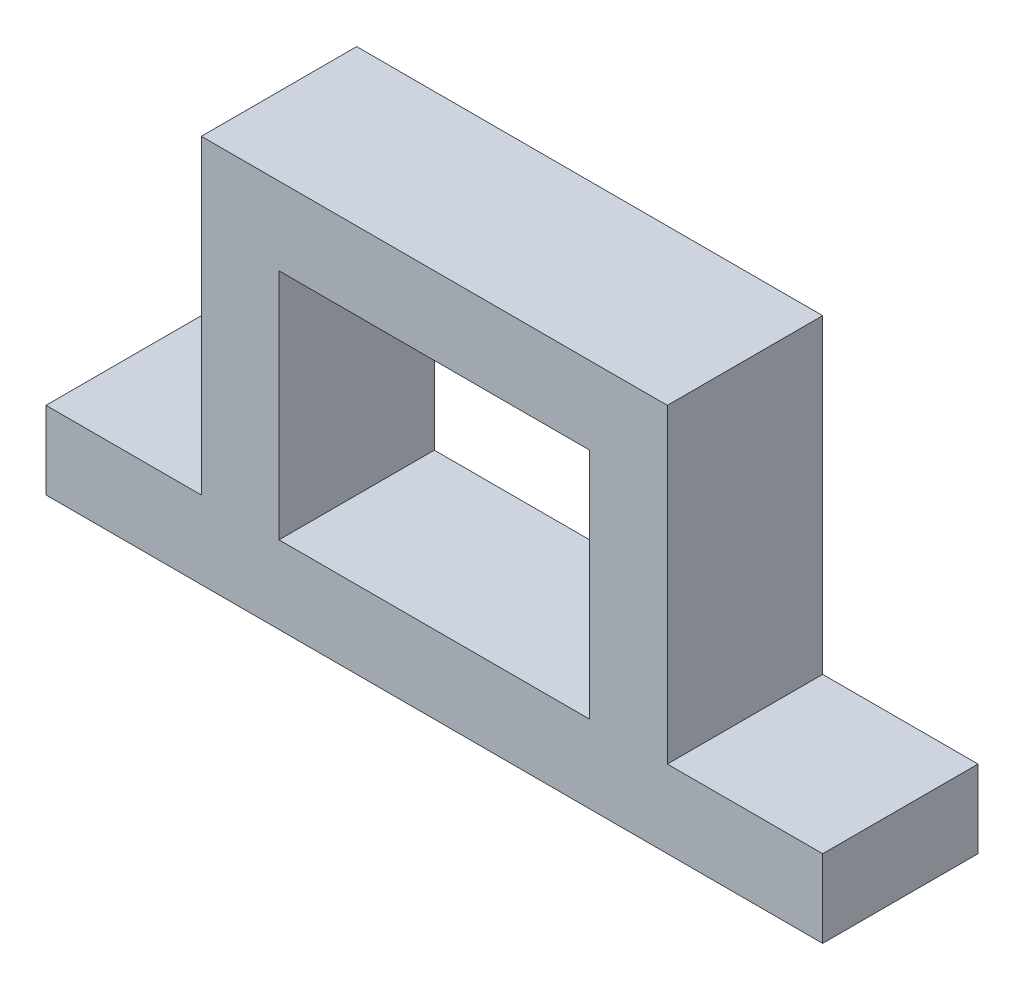
ISO-10303-21;
HEADER;
FILE_DESCRIPTION(('STEP AP214'),'2;1');
FILE_NAME('part.step','',(''),(''),'','','');
FILE_SCHEMA(('AUTOMOTIVE_DESIGN { 1 0 10303 214 1 1 1 1 }'));
ENDSEC;
DATA;
#1=APPLICATION_CONTEXT('core data for automotive mechanical design processes');
#2=APPLICATION_PROTOCOL_DEFINITION('international standard','automotive_design',2000,#1);
#3=PRODUCT_CONTEXT('',#1,'mechanical');
#4=PRODUCT('Part','Part','',(#3));
#5=PRODUCT_RELATED_PRODUCT_CATEGORY('part','',(#4));
#6=PRODUCT_DEFINITION_FORMATION('','',#4);
#7=PRODUCT_DEFINITION_CONTEXT('part definition',#1,'design');
#8=PRODUCT_DEFINITION('design','',#6,#7);
#9=PRODUCT_DEFINITION_SHAPE('','',#8);
#10=(LENGTH_UNIT() NAMED_UNIT(*) SI_UNIT(.MILLI.,.METRE.));
#11=(NAMED_UNIT(*) PLANE_ANGLE_UNIT() SI_UNIT($,.RADIAN.));
#12=(NAMED_UNIT(*) SI_UNIT($,.STERADIAN.) SOLID_ANGLE_UNIT());
#13=UNCERTAINTY_MEASURE_WITH_UNIT(LENGTH_MEASURE(1.E-05),#10,'distance_accuracy_value','');
#14=(GEOMETRIC_REPRESENTATION_CONTEXT(3) GLOBAL_UNCERTAINTY_ASSIGNED_CONTEXT((#13)) GLOBAL_UNIT_ASSIGNED_CONTEXT((#10,
#11,#12)) REPRESENTATION_CONTEXT('',''));
#15=CARTESIAN_POINT('',(0.,0.,0.));
#16=DIRECTION('',(0.,0.,1.));
#17=DIRECTION('',(1.,0.,0.));
#18=AXIS2_PLACEMENT_3D('',#15,#16,#17);
#19=CARTESIAN_POINT('',(0.,0.,10.));
#20=DIRECTION('',(-1.,0.,0.));
#21=DIRECTION('',(0.,0.,1.));
#22=AXIS2_PLACEMENT_3D('',#19,#20,#21);
#23=PLANE('',#22);
#24=DIRECTION('',(0.,0.,-1.));
#25=VECTOR('',#24,1.);
#26=CARTESIAN_POINT('',(0.,5.,10.));
#27=LINE('',#26,#25);
#28=CARTESIAN_POINT('',(0.,5.,10.));
#29=VERTEX_POINT('',#28);
#30=CARTESIAN_POINT('',(0.,5.,0.));
#31=VERTEX_POINT('',#30);
#32=EDGE_CURVE('E191',#29,#31,#27,.T.);
#33=ORIENTED_EDGE('',*,*,#32,.F.);
#34=DIRECTION('',(0.,1.,0.));
#35=VECTOR('',#34,1.);
#36=CARTESIAN_POINT('',(0.,0.,10.));
#37=LINE('',#36,#35);
#38=CARTESIAN_POINT('',(0.,25.,10.));
#39=VERTEX_POINT('',#38);
#40=EDGE_CURVE('E195',#29,#39,#37,.T.);
#41=ORIENTED_EDGE('',*,*,#40,.T.);
#42=DIRECTION('',(0.,0.,-1.));
#43=VECTOR('',#42,1.);
#44=CARTESIAN_POINT('',(0.,25.,10.));
#45=LINE('',#44,#43);
#46=CARTESIAN_POINT('',(0.,25.,0.));
#47=VERTEX_POINT('',#46);
#48=EDGE_CURVE('E35',#39,#47,#45,.T.);
#49=ORIENTED_EDGE('',*,*,#48,.T.);
#50=DIRECTION('',(0.,1.,0.));
#51=VECTOR('',#50,1.);
#52=CARTESIAN_POINT('',(0.,0.,0.));
#53=LINE('',#52,#51);
#54=EDGE_CURVE('E194',#31,#47,#53,.T.);
#55=ORIENTED_EDGE('',*,*,#54,.F.);
#56=EDGE_LOOP('',(#33,#41,#49,#55));
#57=FACE_BOUND('',#56,.T.);
#58=ADVANCED_FACE('F32',(#57),#23,.T.);
#59=CARTESIAN_POINT('',(0.,0.,10.));
#60=DIRECTION('',(0.,1.,0.));
#61=DIRECTION('',(0.,0.,1.));
#62=AXIS2_PLACEMENT_3D('',#59,#60,#61);
#63=PLANE('',#62);
#64=DIRECTION('',(1.,0.,0.));
#65=VECTOR('',#64,1.);
#66=CARTESIAN_POINT('',(0.,0.,0.));
#67=LINE('',#66,#65);
#68=CARTESIAN_POINT('',(-10.,0.,0.));
#69=VERTEX_POINT('',#68);
#70=CARTESIAN_POINT('',(40.,0.,0.));
#71=VERTEX_POINT('',#70);
#72=EDGE_CURVE('E198',#69,#71,#67,.T.);
#73=ORIENTED_EDGE('',*,*,#72,.T.);
#74=DIRECTION('',(0.,0.,1.));
#75=VECTOR('',#74,1.);
#76=CARTESIAN_POINT('',(40.,0.,-50.2493781056044));
#77=LINE('',#76,#75);
#78=CARTESIAN_POINT('',(40.,0.,10.));
#79=VERTEX_POINT('',#78);
#80=EDGE_CURVE('E162',#71,#79,#77,.T.);
#81=ORIENTED_EDGE('',*,*,#80,.T.);
#82=DIRECTION('',(1.,0.,0.));
#83=VECTOR('',#82,1.);
#84=CARTESIAN_POINT('',(0.,0.,10.));
#85=LINE('',#84,#83);
#86=CARTESIAN_POINT('',(-10.,0.,10.));
#87=VERTEX_POINT('',#86);
#88=EDGE_CURVE('E203',#87,#79,#85,.T.);
#89=ORIENTED_EDGE('',*,*,#88,.F.);
#90=DIRECTION('',(0.,0.,1.));
#91=VECTOR('',#90,1.);
#92=CARTESIAN_POINT('',(-10.,0.,-50.2493781056044));
#93=LINE('',#92,#91);
#94=EDGE_CURVE('E172',#69,#87,#93,.T.);
#95=ORIENTED_EDGE('',*,*,#94,.F.);
#96=EDGE_LOOP('',(#73,#81,#89,#95));
#97=FACE_BOUND('',#96,.T.);
#98=ADVANCED_FACE('F214',(#97),#63,.F.);
#99=CARTESIAN_POINT('',(30.,0.,10.));
#100=DIRECTION('',(-1.,0.,0.));
#101=DIRECTION('',(0.,0.,1.));
#102=AXIS2_PLACEMENT_3D('',#99,#100,#101);
#103=PLANE('',#102);
#104=DIRECTION('',(0.,1.,0.));
#105=VECTOR('',#104,1.);
#106=CARTESIAN_POINT('',(30.,0.,10.));
#107=LINE('',#106,#105);
#108=CARTESIAN_POINT('',(30.,5.,10.));
#109=VERTEX_POINT('',#108);
#110=CARTESIAN_POINT('',(30.,25.,10.));
#111=VERTEX_POINT('',#110);
#112=EDGE_CURVE('E201',#109,#111,#107,.T.);
#113=ORIENTED_EDGE('',*,*,#112,.F.);
#114=DIRECTION('',(0.,0.,-1.));
#115=VECTOR('',#114,1.);
#116=CARTESIAN_POINT('',(30.,5.,10.));
#117=LINE('',#116,#115);
#118=CARTESIAN_POINT('',(30.,5.,0.));
#119=VERTEX_POINT('',#118);
#120=EDGE_CURVE('E188',#109,#119,#117,.T.);
#121=ORIENTED_EDGE('',*,*,#120,.T.);
#122=DIRECTION('',(0.,1.,0.));
#123=VECTOR('',#122,1.);
#124=CARTESIAN_POINT('',(30.,0.,0.));
#125=LINE('',#124,#123);
#126=CARTESIAN_POINT('',(30.,25.,0.));
#127=VERTEX_POINT('',#126);
#128=EDGE_CURVE('E209',#119,#127,#125,.T.);
#129=ORIENTED_EDGE('',*,*,#128,.T.);
#130=DIRECTION('',(0.,0.,-1.));
#131=VECTOR('',#130,1.);
#132=CARTESIAN_POINT('',(30.,25.,10.));
#133=LINE('',#132,#131);
#134=EDGE_CURVE('E11',#111,#127,#133,.T.);
#135=ORIENTED_EDGE('',*,*,#134,.F.);
#136=EDGE_LOOP('',(#113,#121,#129,#135));
#137=FACE_BOUND('',#136,.T.);
#138=ADVANCED_FACE('F230',(#137),#103,.F.);
#139=CARTESIAN_POINT('',(0.,25.,10.));
#140=DIRECTION('',(0.,1.,0.));
#141=DIRECTION('',(0.,0.,1.));
#142=AXIS2_PLACEMENT_3D('',#139,#140,#141);
#143=PLANE('',#142);
#144=DIRECTION('',(1.,0.,0.));
#145=VECTOR('',#144,1.);
#146=CARTESIAN_POINT('',(0.,25.,0.));
#147=LINE('',#146,#145);
#148=EDGE_CURVE('E206',#47,#127,#147,.T.);
#149=ORIENTED_EDGE('',*,*,#148,.F.);
#150=ORIENTED_EDGE('',*,*,#48,.F.);
#151=DIRECTION('',(1.,0.,0.));
#152=VECTOR('',#151,1.);
#153=CARTESIAN_POINT('',(0.,25.,10.));
#154=LINE('',#153,#152);
#155=EDGE_CURVE('E197',#39,#111,#154,.T.);
#156=ORIENTED_EDGE('',*,*,#155,.T.);
#157=ORIENTED_EDGE('',*,*,#134,.T.);
#158=EDGE_LOOP('',(#149,#150,#156,#157));
#159=FACE_BOUND('',#158,.T.);
#160=ADVANCED_FACE('F237',(#159),#143,.T.);
#161=CARTESIAN_POINT('',(0.,0.,10.));
#162=DIRECTION('',(0.,0.,-1.));
#163=DIRECTION('',(-1.,0.,0.));
#164=AXIS2_PLACEMENT_3D('',#161,#162,#163);
#165=PLANE('',#164);
#166=DIRECTION('',(-1.,0.,0.));
#167=VECTOR('',#166,1.);
#168=CARTESIAN_POINT('',(0.,5.,10.));
#169=LINE('',#168,#167);
#170=CARTESIAN_POINT('',(25.,5.,10.));
#171=VERTEX_POINT('',#170);
#172=CARTESIAN_POINT('',(5.,5.,10.));
#173=VERTEX_POINT('',#172);
#174=EDGE_CURVE('E145',#171,#173,#169,.T.);
#175=ORIENTED_EDGE('',*,*,#174,.T.);
#176=DIRECTION('',(0.,1.,0.));
#177=VECTOR('',#176,1.);
#178=CARTESIAN_POINT('',(5.,0.,10.));
#179=LINE('',#178,#177);
#180=CARTESIAN_POINT('',(5.,20.,10.));
#181=VERTEX_POINT('',#180);
#182=EDGE_CURVE('E126',#173,#181,#179,.T.);
#183=ORIENTED_EDGE('',*,*,#182,.T.);
#184=DIRECTION('',(1.,0.,0.));
#185=VECTOR('',#184,1.);
#186=CARTESIAN_POINT('',(0.,20.,10.));
#187=LINE('',#186,#185);
#188=CARTESIAN_POINT('',(25.,20.,10.));
#189=VERTEX_POINT('',#188);
#190=EDGE_CURVE('E154',#181,#189,#187,.T.);
#191=ORIENTED_EDGE('',*,*,#190,.T.);
#192=DIRECTION('',(0.,-1.,0.));
#193=VECTOR('',#192,1.);
#194=CARTESIAN_POINT('',(25.,0.,10.));
#195=LINE('',#194,#193);
#196=EDGE_CURVE('E151',#189,#171,#195,.T.);
#197=ORIENTED_EDGE('',*,*,#196,.T.);
#198=EDGE_LOOP('',(#175,#183,#191,#197));
#199=FACE_BOUND('',#198,.T.);
#200=ORIENTED_EDGE('',*,*,#40,.F.);
#201=DIRECTION('',(-1.,0.,0.));
#202=VECTOR('',#201,1.);
#203=CARTESIAN_POINT('',(-10.,5.,10.));
#204=LINE('',#203,#202);
#205=CARTESIAN_POINT('',(-10.,5.,10.));
#206=VERTEX_POINT('',#205);
#207=EDGE_CURVE('E163',#29,#206,#204,.T.);
#208=ORIENTED_EDGE('',*,*,#207,.T.);
#209=DIRECTION('',(0.,-1.,0.));
#210=VECTOR('',#209,1.);
#211=CARTESIAN_POINT('',(-10.,0.,10.));
#212=LINE('',#211,#210);
#213=EDGE_CURVE('E158',#206,#87,#212,.T.);
#214=ORIENTED_EDGE('',*,*,#213,.T.);
#215=ORIENTED_EDGE('',*,*,#88,.T.);
#216=DIRECTION('',(0.,1.,0.));
#217=VECTOR('',#216,1.);
#218=CARTESIAN_POINT('',(40.,0.,10.));
#219=LINE('',#218,#217);
#220=CARTESIAN_POINT('',(40.,5.,10.));
#221=VERTEX_POINT('',#220);
#222=EDGE_CURVE('E164',#79,#221,#219,.T.);
#223=ORIENTED_EDGE('',*,*,#222,.T.);
#224=EDGE_CURVE('E159',#221,#109,#204,.T.);
#225=ORIENTED_EDGE('',*,*,#224,.T.);
#226=ORIENTED_EDGE('',*,*,#112,.T.);
#227=ORIENTED_EDGE('',*,*,#155,.F.);
#228=EDGE_LOOP('',(#200,#208,#214,#215,#223,#225,#226,#227));
#229=FACE_BOUND('',#228,.T.);
#230=ADVANCED_FACE('F225',(#199,#229),#165,.F.);
#231=CARTESIAN_POINT('',(0.,0.,0.));
#232=DIRECTION('',(0.,0.,-1.));
#233=DIRECTION('',(-1.,0.,0.));
#234=AXIS2_PLACEMENT_3D('',#231,#232,#233);
#235=PLANE('',#234);
#236=DIRECTION('',(0.,-1.,0.));
#237=VECTOR('',#236,1.);
#238=CARTESIAN_POINT('',(5.,5.,0.));
#239=LINE('',#238,#237);
#240=CARTESIAN_POINT('',(5.,20.,0.));
#241=VERTEX_POINT('',#240);
#242=CARTESIAN_POINT('',(5.,5.,0.));
#243=VERTEX_POINT('',#242);
#244=EDGE_CURVE('E123',#241,#243,#239,.T.);
#245=ORIENTED_EDGE('',*,*,#244,.T.);
#246=DIRECTION('',(1.,0.,0.));
#247=VECTOR('',#246,1.);
#248=CARTESIAN_POINT('',(5.,5.,0.));
#249=LINE('',#248,#247);
#250=CARTESIAN_POINT('',(25.,5.,0.));
#251=VERTEX_POINT('',#250);
#252=EDGE_CURVE('E132',#243,#251,#249,.T.);
#253=ORIENTED_EDGE('',*,*,#252,.T.);
#254=DIRECTION('',(0.,1.,0.));
#255=VECTOR('',#254,1.);
#256=CARTESIAN_POINT('',(25.,5.,0.));
#257=LINE('',#256,#255);
#258=CARTESIAN_POINT('',(25.,20.,0.));
#259=VERTEX_POINT('',#258);
#260=EDGE_CURVE('E54',#251,#259,#257,.T.);
#261=ORIENTED_EDGE('',*,*,#260,.T.);
#262=DIRECTION('',(-1.,0.,0.));
#263=VECTOR('',#262,1.);
#264=CARTESIAN_POINT('',(5.,20.,0.));
#265=LINE('',#264,#263);
#266=EDGE_CURVE('E129',#259,#241,#265,.T.);
#267=ORIENTED_EDGE('',*,*,#266,.T.);
#268=EDGE_LOOP('',(#245,#253,#261,#267));
#269=FACE_BOUND('',#268,.T.);
#270=ORIENTED_EDGE('',*,*,#128,.F.);
#271=DIRECTION('',(-1.,0.,0.));
#272=VECTOR('',#271,1.);
#273=CARTESIAN_POINT('',(-10.,5.,0.));
#274=LINE('',#273,#272);
#275=CARTESIAN_POINT('',(40.,5.,0.));
#276=VERTEX_POINT('',#275);
#277=EDGE_CURVE('E174',#276,#119,#274,.T.);
#278=ORIENTED_EDGE('',*,*,#277,.F.);
#279=DIRECTION('',(0.,1.,0.));
#280=VECTOR('',#279,1.);
#281=CARTESIAN_POINT('',(40.,0.,0.));
#282=LINE('',#281,#280);
#283=EDGE_CURVE('E177',#71,#276,#282,.T.);
#284=ORIENTED_EDGE('',*,*,#283,.F.);
#285=ORIENTED_EDGE('',*,*,#72,.F.);
#286=DIRECTION('',(0.,-1.,0.));
#287=VECTOR('',#286,1.);
#288=CARTESIAN_POINT('',(-10.,0.,0.));
#289=LINE('',#288,#287);
#290=CARTESIAN_POINT('',(-10.,5.,0.));
#291=VERTEX_POINT('',#290);
#292=EDGE_CURVE('E169',#291,#69,#289,.T.);
#293=ORIENTED_EDGE('',*,*,#292,.F.);
#294=EDGE_CURVE('E176',#31,#291,#274,.T.);
#295=ORIENTED_EDGE('',*,*,#294,.F.);
#296=ORIENTED_EDGE('',*,*,#54,.T.);
#297=ORIENTED_EDGE('',*,*,#148,.T.);
#298=EDGE_LOOP('',(#270,#278,#284,#285,#293,#295,#296,#297));
#299=FACE_BOUND('',#298,.T.);
#300=ADVANCED_FACE('F136',(#269,#299),#235,.T.);
#301=CARTESIAN_POINT('',(40.,0.,-50.2493781056044));
#302=DIRECTION('',(1.,0.,0.));
#303=DIRECTION('',(0.,0.,-1.));
#304=AXIS2_PLACEMENT_3D('',#301,#302,#303);
#305=PLANE('',#304);
#306=ORIENTED_EDGE('',*,*,#80,.F.);
#307=ORIENTED_EDGE('',*,*,#283,.T.);
#308=DIRECTION('',(0.,0.,1.));
#309=VECTOR('',#308,1.);
#310=CARTESIAN_POINT('',(40.,5.,-50.2493781056044));
#311=LINE('',#310,#309);
#312=EDGE_CURVE('E180',#276,#221,#311,.T.);
#313=ORIENTED_EDGE('',*,*,#312,.T.);
#314=ORIENTED_EDGE('',*,*,#222,.F.);
#315=EDGE_LOOP('',(#306,#307,#313,#314));
#316=FACE_BOUND('',#315,.T.);
#317=ADVANCED_FACE('F221',(#316),#305,.T.);
#318=CARTESIAN_POINT('',(-10.,5.,-50.2493781056044));
#319=DIRECTION('',(0.,1.,0.));
#320=DIRECTION('',(0.,0.,1.));
#321=AXIS2_PLACEMENT_3D('',#318,#319,#320);
#322=PLANE('',#321);
#323=ORIENTED_EDGE('',*,*,#120,.F.);
#324=ORIENTED_EDGE('',*,*,#224,.F.);
#325=ORIENTED_EDGE('',*,*,#312,.F.);
#326=ORIENTED_EDGE('',*,*,#277,.T.);
#327=EDGE_LOOP('',(#323,#324,#325,#326));
#328=FACE_BOUND('',#327,.T.);
#329=ADVANCED_FACE('F228',(#328),#322,.T.);
#330=ORIENTED_EDGE('',*,*,#207,.F.);
#331=ORIENTED_EDGE('',*,*,#32,.T.);
#332=ORIENTED_EDGE('',*,*,#294,.T.);
#333=DIRECTION('',(0.,0.,1.));
#334=VECTOR('',#333,1.);
#335=CARTESIAN_POINT('',(-10.,5.,-50.2493781056044));
#336=LINE('',#335,#334);
#337=EDGE_CURVE('E173',#291,#206,#336,.T.);
#338=ORIENTED_EDGE('',*,*,#337,.T.);
#339=EDGE_LOOP('',(#330,#331,#332,#338));
#340=FACE_BOUND('',#339,.T.);
#341=ADVANCED_FACE('F242',(#340),#322,.T.);
#342=CARTESIAN_POINT('',(-10.,0.,-50.2493781056044));
#343=DIRECTION('',(-1.,0.,0.));
#344=DIRECTION('',(0.,0.,1.));
#345=AXIS2_PLACEMENT_3D('',#342,#343,#344);
#346=PLANE('',#345);
#347=ORIENTED_EDGE('',*,*,#337,.F.);
#348=ORIENTED_EDGE('',*,*,#292,.T.);
#349=ORIENTED_EDGE('',*,*,#94,.T.);
#350=ORIENTED_EDGE('',*,*,#213,.F.);
#351=EDGE_LOOP('',(#347,#348,#349,#350));
#352=FACE_BOUND('',#351,.T.);
#353=ADVANCED_FACE('F246',(#352),#346,.T.);
#354=CARTESIAN_POINT('',(5.,5.,0.));
#355=DIRECTION('',(-1.,0.,0.));
#356=DIRECTION('',(0.,0.,1.));
#357=AXIS2_PLACEMENT_3D('',#354,#355,#356);
#358=PLANE('',#357);
#359=DIRECTION('',(0.,0.,1.));
#360=VECTOR('',#359,1.);
#361=CARTESIAN_POINT('',(5.,5.,0.));
#362=LINE('',#361,#360);
#363=EDGE_CURVE('E46',#243,#173,#362,.T.);
#364=ORIENTED_EDGE('',*,*,#363,.F.);
#365=ORIENTED_EDGE('',*,*,#244,.F.);
#366=DIRECTION('',(0.,0.,1.));
#367=VECTOR('',#366,1.);
#368=CARTESIAN_POINT('',(5.,20.,0.));
#369=LINE('',#368,#367);
#370=EDGE_CURVE('E143',#241,#181,#369,.T.);
#371=ORIENTED_EDGE('',*,*,#370,.T.);
#372=ORIENTED_EDGE('',*,*,#182,.F.);
#373=EDGE_LOOP('',(#364,#365,#371,#372));
#374=FACE_BOUND('',#373,.T.);
#375=ADVANCED_FACE('F120',(#374),#358,.F.);
#376=CARTESIAN_POINT('',(5.,20.,0.));
#377=DIRECTION('',(0.,1.,0.));
#378=DIRECTION('',(0.,0.,1.));
#379=AXIS2_PLACEMENT_3D('',#376,#377,#378);
#380=PLANE('',#379);
#381=ORIENTED_EDGE('',*,*,#370,.F.);
#382=ORIENTED_EDGE('',*,*,#266,.F.);
#383=DIRECTION('',(0.,0.,1.));
#384=VECTOR('',#383,1.);
#385=CARTESIAN_POINT('',(25.,20.,0.));
#386=LINE('',#385,#384);
#387=EDGE_CURVE('E146',#259,#189,#386,.T.);
#388=ORIENTED_EDGE('',*,*,#387,.T.);
#389=ORIENTED_EDGE('',*,*,#190,.F.);
#390=EDGE_LOOP('',(#381,#382,#388,#389));
#391=FACE_BOUND('',#390,.T.);
#392=ADVANCED_FACE('F253',(#391),#380,.F.);
#393=CARTESIAN_POINT('',(25.,5.,0.));
#394=DIRECTION('',(1.,0.,0.));
#395=DIRECTION('',(0.,1.,0.));
#396=AXIS2_PLACEMENT_3D('',#393,#394,#395);
#397=PLANE('',#396);
#398=ORIENTED_EDGE('',*,*,#387,.F.);
#399=ORIENTED_EDGE('',*,*,#260,.F.);
#400=DIRECTION('',(0.,0.,1.));
#401=VECTOR('',#400,1.);
#402=CARTESIAN_POINT('',(25.,5.,0.));
#403=LINE('',#402,#401);
#404=EDGE_CURVE('E128',#251,#171,#403,.T.);
#405=ORIENTED_EDGE('',*,*,#404,.T.);
#406=ORIENTED_EDGE('',*,*,#196,.F.);
#407=EDGE_LOOP('',(#398,#399,#405,#406));
#408=FACE_BOUND('',#407,.T.);
#409=ADVANCED_FACE('F319',(#408),#397,.F.);
#410=CARTESIAN_POINT('',(5.,5.,0.));
#411=DIRECTION('',(0.,-1.,0.));
#412=DIRECTION('',(0.,0.,-1.));
#413=AXIS2_PLACEMENT_3D('',#410,#411,#412);
#414=PLANE('',#413);
#415=ORIENTED_EDGE('',*,*,#404,.F.);
#416=ORIENTED_EDGE('',*,*,#252,.F.);
#417=ORIENTED_EDGE('',*,*,#363,.T.);
#418=ORIENTED_EDGE('',*,*,#174,.F.);
#419=EDGE_LOOP('',(#415,#416,#417,#418));
#420=FACE_BOUND('',#419,.T.);
#421=ADVANCED_FACE('F133',(#420),#414,.F.);
#422=CLOSED_SHELL('',(#58,#98,#138,#160,#230,#300,#317,#329,#341,#353,#375,#392,#409,#421));
#423=MANIFOLD_SOLID_BREP('B2',#422);
#424=ADVANCED_BREP_SHAPE_REPRESENTATION('',(#18,#423),#14);
#425=SHAPE_DEFINITION_REPRESENTATION(#9,#424);
ENDSEC;
END-ISO-10303-21;
